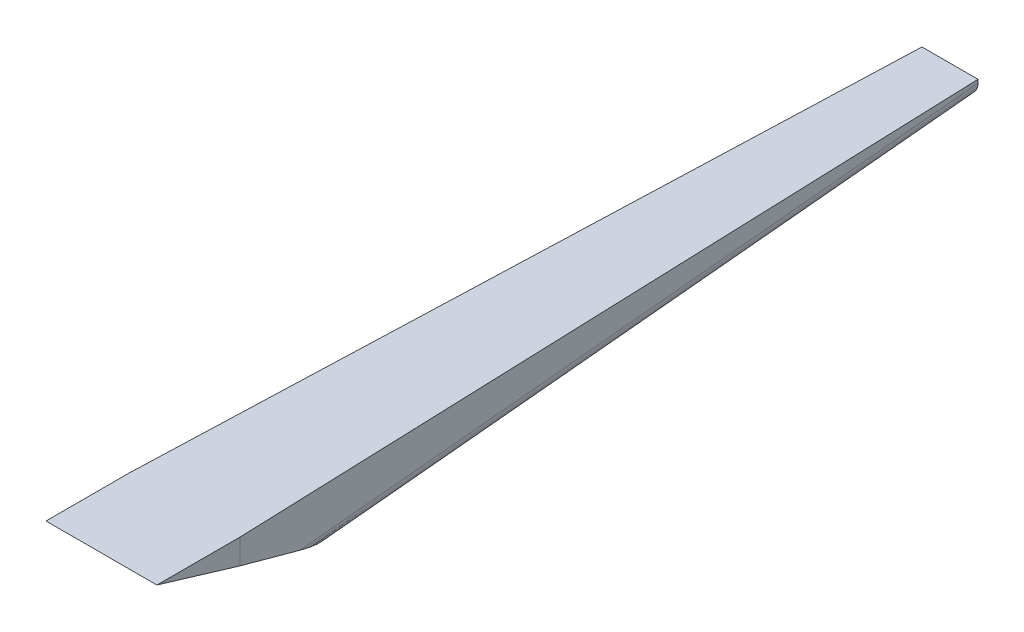
ISO-10303-21;
HEADER;
FILE_DESCRIPTION(('STEP AP214'),'2;1');
FILE_NAME('part.step','',(''),(''),'','','');
FILE_SCHEMA(('AUTOMOTIVE_DESIGN { 1 0 10303 214 1 1 1 1 }'));
ENDSEC;
DATA;
#1=APPLICATION_CONTEXT('core data for automotive mechanical design processes');
#2=APPLICATION_PROTOCOL_DEFINITION('international standard','automotive_design',2000,#1);
#3=PRODUCT_CONTEXT('',#1,'mechanical');
#4=PRODUCT('Part','Part','',(#3));
#5=PRODUCT_RELATED_PRODUCT_CATEGORY('part','',(#4));
#6=PRODUCT_DEFINITION_FORMATION('','',#4);
#7=PRODUCT_DEFINITION_CONTEXT('part definition',#1,'design');
#8=PRODUCT_DEFINITION('design','',#6,#7);
#9=PRODUCT_DEFINITION_SHAPE('','',#8);
#10=(LENGTH_UNIT() NAMED_UNIT(*) SI_UNIT(.MILLI.,.METRE.));
#11=(NAMED_UNIT(*) PLANE_ANGLE_UNIT() SI_UNIT($,.RADIAN.));
#12=(NAMED_UNIT(*) SI_UNIT($,.STERADIAN.) SOLID_ANGLE_UNIT());
#13=UNCERTAINTY_MEASURE_WITH_UNIT(LENGTH_MEASURE(1.E-05),#10,'distance_accuracy_value','');
#14=(GEOMETRIC_REPRESENTATION_CONTEXT(3) GLOBAL_UNCERTAINTY_ASSIGNED_CONTEXT((#13)) GLOBAL_UNIT_ASSIGNED_CONTEXT((#10,
#11,#12)) REPRESENTATION_CONTEXT('',''));
#15=CARTESIAN_POINT('',(0.,0.,0.));
#16=DIRECTION('',(0.,0.,1.));
#17=DIRECTION('',(1.,0.,0.));
#18=AXIS2_PLACEMENT_3D('',#15,#16,#17);
#19=CARTESIAN_POINT('',(0.,5.08000000000002,0.));
#20=DIRECTION('',(0.,1.,0.));
#21=DIRECTION('',(0.,0.,1.));
#22=AXIS2_PLACEMENT_3D('',#19,#20,#21);
#23=PLANE('',#22);
#24=DIRECTION('',(-1.,0.,0.));
#25=VECTOR('',#24,1.);
#26=CARTESIAN_POINT('',(0.,5.08000000000002,-1081.98530026192));
#27=LINE('',#26,#25);
#28=CARTESIAN_POINT('',(25.6657479035088,5.08000000000002,-1081.98530026192));
#29=VERTEX_POINT('',#28);
#30=CARTESIAN_POINT('',(-25.6657479035088,5.08000000000002,-1081.98530026192));
#31=VERTEX_POINT('',#30);
#32=EDGE_CURVE('E134',#29,#31,#27,.T.);
#33=ORIENTED_EDGE('',*,*,#32,.T.);
#34=DIRECTION('',(-0.0358377664788086,0.,0.999357620921465));
#35=VECTOR('',#34,1.);
#36=CARTESIAN_POINT('',(-64.3838118894423,5.08000000000002,-2.30885517576966));
#37=LINE('',#36,#35);
#38=CARTESIAN_POINT('',(-50.8,5.08000000000002,-381.1016));
#39=VERTEX_POINT('',#38);
#40=EDGE_CURVE('E124',#31,#39,#37,.T.);
#41=ORIENTED_EDGE('',*,*,#40,.T.);
#42=DIRECTION('',(0.,0.,-1.));
#43=VECTOR('',#42,1.);
#44=CARTESIAN_POINT('',(-50.8,5.08000000000002,-381.1016));
#45=LINE('',#44,#43);
#46=CARTESIAN_POINT('',(-50.8,5.08000000000002,-304.8));
#47=VERTEX_POINT('',#46);
#48=EDGE_CURVE('E111',#47,#39,#45,.T.);
#49=ORIENTED_EDGE('',*,*,#48,.F.);
#50=DIRECTION('',(1.,0.,0.));
#51=VECTOR('',#50,1.);
#52=CARTESIAN_POINT('',(-50.810023925187,5.08000000000002,-304.8));
#53=LINE('',#52,#51);
#54=CARTESIAN_POINT('',(50.8,5.08000000000002,-304.8));
#55=VERTEX_POINT('',#54);
#56=EDGE_CURVE('E122',#47,#55,#53,.T.);
#57=ORIENTED_EDGE('',*,*,#56,.T.);
#58=DIRECTION('',(0.,0.,1.));
#59=VECTOR('',#58,1.);
#60=CARTESIAN_POINT('',(50.8,5.08000000000002,-381.1016));
#61=LINE('',#60,#59);
#62=CARTESIAN_POINT('',(50.8,5.08000000000002,-381.1016));
#63=VERTEX_POINT('',#62);
#64=EDGE_CURVE('E126',#63,#55,#61,.T.);
#65=ORIENTED_EDGE('',*,*,#64,.F.);
#66=DIRECTION('',(-0.0358377664788086,0.,-0.999357620921465));
#67=VECTOR('',#66,1.);
#68=CARTESIAN_POINT('',(64.3838118894422,5.08000000000002,-2.30885517576965));
#69=LINE('',#68,#67);
#70=EDGE_CURVE('E130',#63,#29,#69,.T.);
#71=ORIENTED_EDGE('',*,*,#70,.T.);
#72=EDGE_LOOP('',(#33,#41,#49,#57,#65,#71));
#73=FACE_BOUND('',#72,.T.);
#74=ADVANCED_FACE('F45',(#73),#23,.T.);
#75=CARTESIAN_POINT('',(0.,0.,-1081.98530026192));
#76=DIRECTION('',(0.,0.,1.));
#77=DIRECTION('',(1.,0.,0.));
#78=AXIS2_PLACEMENT_3D('',#75,#76,#77);
#79=PLANE('',#78);
#80=ORIENTED_EDGE('',*,*,#32,.F.);
#81=DIRECTION('',(0.,1.,0.));
#82=VECTOR('',#81,1.);
#83=CARTESIAN_POINT('',(25.6657479035088,0.,-1081.98530026192));
#84=LINE('',#83,#82);
#85=CARTESIAN_POINT('',(25.6657479035088,2.10957667069887,-1081.98530026192));
#86=VERTEX_POINT('',#85);
#87=EDGE_CURVE('E145',#86,#29,#84,.T.);
#88=ORIENTED_EDGE('',*,*,#87,.F.);
#89=CARTESIAN_POINT('',(12.9575844451766,2.13569134690628,-1081.98530026192));
#90=DIRECTION('',(0.,0.,1.));
#91=DIRECTION('',(0.52999894000318,-0.847998304005088,0.));
#92=AXIS2_PLACEMENT_3D('',#89,#90,#91);
#93=ELLIPSE('',#92,12.7290380548547,12.7);
#94=CARTESIAN_POINT('',(12.9836729992225,-10.5851966456141,-1081.98530026192));
#95=VERTEX_POINT('',#94);
#96=EDGE_CURVE('E135',#86,#95,#93,.F.);
#97=ORIENTED_EDGE('',*,*,#96,.T.);
#98=DIRECTION('',(1.,0.,0.));
#99=VECTOR('',#98,1.);
#100=CARTESIAN_POINT('',(0.,-10.585196645614,-1081.98530026192));
#101=LINE('',#100,#99);
#102=CARTESIAN_POINT('',(-12.9836729992225,-10.5851966456141,-1081.98530026192));
#103=VERTEX_POINT('',#102);
#104=EDGE_CURVE('E144',#103,#95,#101,.T.);
#105=ORIENTED_EDGE('',*,*,#104,.F.);
#106=CARTESIAN_POINT('',(-12.9575844451766,2.13569134690629,-1081.98530026192));
#107=DIRECTION('',(0.,0.,1.));
#108=DIRECTION('',(-0.52999894000318,-0.847998304005088,0.));
#109=AXIS2_PLACEMENT_3D('',#106,#107,#108);
#110=ELLIPSE('',#109,12.7290380548547,12.7);
#111=CARTESIAN_POINT('',(-25.6657479035088,2.10957667069887,-1081.98530026192));
#112=VERTEX_POINT('',#111);
#113=EDGE_CURVE('E125',#103,#112,#110,.F.);
#114=ORIENTED_EDGE('',*,*,#113,.T.);
#115=DIRECTION('',(0.,-1.,0.));
#116=VECTOR('',#115,1.);
#117=CARTESIAN_POINT('',(-25.6657479035088,0.,-1081.98530026192));
#118=LINE('',#117,#116);
#119=EDGE_CURVE('E141',#31,#112,#118,.T.);
#120=ORIENTED_EDGE('',*,*,#119,.F.);
#121=EDGE_LOOP('',(#80,#88,#97,#105,#114,#120));
#122=FACE_BOUND('',#121,.T.);
#123=ADVANCED_FACE('F196',(#122),#79,.F.);
#124=CARTESIAN_POINT('',(50.8,-50.8,-381.1016));
#125=DIRECTION('',(1.,0.,0.));
#126=DIRECTION('',(0.,0.,-1.));
#127=AXIS2_PLACEMENT_3D('',#124,#125,#126);
#128=PLANE('',#127);
#129=DIRECTION('',(0.,1.,0.));
#130=VECTOR('',#129,1.);
#131=CARTESIAN_POINT('',(50.8,-50.8,-381.1016));
#132=LINE('',#131,#130);
#133=CARTESIAN_POINT('',(50.8,-17.8349847126098,-381.1016));
#134=VERTEX_POINT('',#133);
#135=EDGE_CURVE('E54',#134,#63,#132,.T.);
#136=ORIENTED_EDGE('',*,*,#135,.T.);
#137=ORIENTED_EDGE('',*,*,#64,.T.);
#138=DIRECTION('',(0.,0.287630060624882,0.957741587394495));
#139=VECTOR('',#138,1.);
#140=CARTESIAN_POINT('',(50.8,-20.5622150991169,-390.182646514712));
#141=LINE('',#140,#139);
#142=EDGE_CURVE('E68',#134,#55,#141,.T.);
#143=ORIENTED_EDGE('',*,*,#142,.F.);
#144=EDGE_LOOP('',(#136,#137,#143));
#145=FACE_BOUND('',#144,.T.);
#146=ADVANCED_FACE('F204',(#145),#128,.T.);
#147=CARTESIAN_POINT('',(-50.8,-50.8,-381.1016));
#148=DIRECTION('',(-1.,0.,0.));
#149=DIRECTION('',(0.,0.,1.));
#150=AXIS2_PLACEMENT_3D('',#147,#148,#149);
#151=PLANE('',#150);
#152=DIRECTION('',(0.,-0.287630060624882,-0.957741587394495));
#153=VECTOR('',#152,1.);
#154=CARTESIAN_POINT('',(-50.8,-20.5622150991169,-390.182646514712));
#155=LINE('',#154,#153);
#156=CARTESIAN_POINT('',(-50.8,-17.8349847126097,-381.1016));
#157=VERTEX_POINT('',#156);
#158=EDGE_CURVE('E108',#47,#157,#155,.T.);
#159=ORIENTED_EDGE('',*,*,#158,.F.);
#160=ORIENTED_EDGE('',*,*,#48,.T.);
#161=DIRECTION('',(0.,1.,0.));
#162=VECTOR('',#161,1.);
#163=CARTESIAN_POINT('',(-50.8,-50.8,-381.1016));
#164=LINE('',#163,#162);
#165=EDGE_CURVE('E11',#39,#157,#164,.F.);
#166=ORIENTED_EDGE('',*,*,#165,.T.);
#167=EDGE_LOOP('',(#159,#160,#166));
#168=FACE_BOUND('',#167,.T.);
#169=ADVANCED_FACE('F110',(#168),#151,.T.);
#170=CARTESIAN_POINT('',(64.3838118894422,0.,-2.30885517576965));
#171=DIRECTION('',(-0.999357620921465,0.,0.0358377664788086));
#172=DIRECTION('',(0.0358377664788086,0.,0.999357620921465));
#173=AXIS2_PLACEMENT_3D('',#170,#171,#172);
#174=PLANE('',#173);
#175=ORIENTED_EDGE('',*,*,#70,.F.);
#176=ORIENTED_EDGE('',*,*,#135,.F.);
#177=DIRECTION('',(-0.0343251430179368,-0.287460565595073,-0.957177208140979));
#178=VECTOR('',#177,1.);
#179=CARTESIAN_POINT('',(63.4373129508137,87.9979065456885,-28.70254597879));
#180=LINE('',#179,#178);
#181=CARTESIAN_POINT('',(48.767821308913,-34.8537407779479,-437.770122108174));
#182=VERTEX_POINT('',#181);
#183=EDGE_CURVE('E116',#134,#182,#180,.T.);
#184=ORIENTED_EDGE('',*,*,#183,.T.);
#185=DIRECTION('',(0.0357789954301019,-0.057246392688163,0.997718754965649));
#186=VECTOR('',#185,1.);
#187=CARTESIAN_POINT('',(64.2612478801468,-59.643223291922,-5.7266261133783));
#188=LINE('',#187,#186);
#189=EDGE_CURVE('E164',#182,#86,#188,.F.);
#190=ORIENTED_EDGE('',*,*,#189,.T.);
#191=ORIENTED_EDGE('',*,*,#87,.T.);
#192=EDGE_LOOP('',(#175,#176,#184,#190,#191));
#193=FACE_BOUND('',#192,.T.);
#194=ADVANCED_FACE('F47',(#193),#174,.F.);
#195=CARTESIAN_POINT('',(-64.3838118894423,0.,-2.30885517576966));
#196=DIRECTION('',(0.999357620921465,0.,0.0358377664788086));
#197=DIRECTION('',(0.0358377664788086,0.,-0.999357620921465));
#198=AXIS2_PLACEMENT_3D('',#195,#196,#197);
#199=PLANE('',#198);
#200=ORIENTED_EDGE('',*,*,#40,.F.);
#201=ORIENTED_EDGE('',*,*,#119,.T.);
#202=DIRECTION('',(-0.0357789954301019,-0.057246392688163,0.997718754965649));
#203=VECTOR('',#202,1.);
#204=CARTESIAN_POINT('',(-64.2612478801468,-59.643223291922,-5.72662611337831));
#205=LINE('',#204,#203);
#206=CARTESIAN_POINT('',(-48.7678213089131,-34.8537407779479,-437.770122108174));
#207=VERTEX_POINT('',#206);
#208=EDGE_CURVE('E167',#112,#207,#205,.T.);
#209=ORIENTED_EDGE('',*,*,#208,.T.);
#210=DIRECTION('',(-0.0343251430179368,0.287460565595073,0.957177208140979));
#211=VECTOR('',#210,1.);
#212=CARTESIAN_POINT('',(-63.4373129508137,87.9979065456885,-28.70254597879));
#213=LINE('',#212,#211);
#214=EDGE_CURVE('E178',#207,#157,#213,.T.);
#215=ORIENTED_EDGE('',*,*,#214,.T.);
#216=ORIENTED_EDGE('',*,*,#165,.F.);
#217=EDGE_LOOP('',(#200,#201,#209,#215,#216));
#218=FACE_BOUND('',#217,.T.);
#219=ADVANCED_FACE('F205',(#218),#199,.F.);
#220=CARTESIAN_POINT('',(-50.810023925187,5.08000000000002,-304.8));
#221=DIRECTION('',(0.,0.957741587394495,-0.287630060624882));
#222=DIRECTION('',(0.,0.287630060624882,0.957741587394495));
#223=AXIS2_PLACEMENT_3D('',#220,#221,#222);
#224=PLANE('',#223);
#225=ORIENTED_EDGE('',*,*,#158,.T.);
#226=ORIENTED_EDGE('',*,*,#214,.F.);
#227=CARTESIAN_POINT('',(-36.0622759588693,-34.831815075002,-437.697114587686));
#228=DIRECTION('',(0.,0.957741587394495,-0.287630060624882));
#229=DIRECTION('',(-0.0380719835720617,0.287421528606686,0.957047223996959));
#230=AXIS2_PLACEMENT_3D('',#227,#228,#229);
#231=ELLIPSE('',#230,37.1561059421082,12.7);
#232=CARTESIAN_POINT('',(-34.8130409352791,-45.5121853433046,-473.260277744215));
#233=VERTEX_POINT('',#232);
#234=EDGE_CURVE('E163',#207,#233,#231,.F.);
#235=ORIENTED_EDGE('',*,*,#234,.T.);
#236=DIRECTION('',(-1.,0.,0.));
#237=VECTOR('',#236,1.);
#238=CARTESIAN_POINT('',(1.8594081385154E-13,-45.5121853433046,-473.260277744215));
#239=LINE('',#238,#237);
#240=CARTESIAN_POINT('',(34.8130409352791,-45.5121853433046,-473.260277744215));
#241=VERTEX_POINT('',#240);
#242=EDGE_CURVE('E159',#241,#233,#239,.T.);
#243=ORIENTED_EDGE('',*,*,#242,.F.);
#244=CARTESIAN_POINT('',(36.0622759588692,-34.831815075002,-437.697114587686));
#245=DIRECTION('',(0.,0.957741587394495,-0.287630060624882));
#246=DIRECTION('',(0.0380719835720616,0.287421528606686,0.957047223996959));
#247=AXIS2_PLACEMENT_3D('',#244,#245,#246);
#248=ELLIPSE('',#247,37.1561059421082,12.7);
#249=EDGE_CURVE('E143',#241,#182,#248,.F.);
#250=ORIENTED_EDGE('',*,*,#249,.T.);
#251=ORIENTED_EDGE('',*,*,#183,.F.);
#252=ORIENTED_EDGE('',*,*,#142,.T.);
#253=ORIENTED_EDGE('',*,*,#56,.F.);
#254=EDGE_LOOP('',(#225,#226,#235,#243,#250,#251,#252,#253));
#255=FACE_BOUND('',#254,.T.);
#256=ADVANCED_FACE('F128',(#255),#224,.F.);
#257=CARTESIAN_POINT('',(0.,-72.4281303938191,-4.15572943132336));
#258=DIRECTION('',(0.,0.998357976854082,0.0572830695042076));
#259=DIRECTION('',(0.,-0.0572830695042076,0.998357976854082));
#260=AXIS2_PLACEMENT_3D('',#257,#258,#259);
#261=PLANE('',#260);
#262=DIRECTION('',(-0.0357789954301019,-0.0572463926881631,0.997718754965649));
#263=VECTOR('',#262,1.);
#264=CARTESIAN_POINT('',(-51.5694060944442,-72.3223695979688,-5.99898146180087));
#265=LINE('',#264,#263);
#266=EDGE_CURVE('E140',#233,#103,#265,.F.);
#267=ORIENTED_EDGE('',*,*,#266,.T.);
#268=ORIENTED_EDGE('',*,*,#104,.T.);
#269=DIRECTION('',(0.0357789954301019,-0.057246392688163,0.997718754965649));
#270=VECTOR('',#269,1.);
#271=CARTESIAN_POINT('',(51.5694060944442,-72.3223695979688,-5.99898146180087));
#272=LINE('',#271,#270);
#273=EDGE_CURVE('E158',#95,#241,#272,.T.);
#274=ORIENTED_EDGE('',*,*,#273,.T.);
#275=ORIENTED_EDGE('',*,*,#242,.T.);
#276=EDGE_LOOP('',(#267,#268,#274,#275));
#277=FACE_BOUND('',#276,.T.);
#278=ADVANCED_FACE('F183',(#277),#261,.F.);
#279=CARTESIAN_POINT('',(51.5694060944442,-59.643223291922,-5.27148647909743));
#280=DIRECTION('',(0.0357789954301019,-0.057246392688163,0.997718754965649));
#281=DIRECTION('',(0.,-0.998357976854082,-0.0572830695042076));
#282=AXIS2_PLACEMENT_3D('',#279,#280,#281);
#283=CYLINDRICAL_SURFACE('',#282,12.7);
#284=ORIENTED_EDGE('',*,*,#96,.F.);
#285=ORIENTED_EDGE('',*,*,#189,.F.);
#286=ORIENTED_EDGE('',*,*,#249,.F.);
#287=ORIENTED_EDGE('',*,*,#273,.F.);
#288=EDGE_LOOP('',(#284,#285,#286,#287));
#289=FACE_BOUND('',#288,.T.);
#290=ADVANCED_FACE('F200',(#289),#283,.T.);
#291=CARTESIAN_POINT('',(-51.5694060944442,-59.643223291922,-5.27148647909744));
#292=DIRECTION('',(-0.0357789954301019,-0.0572463926881631,0.997718754965649));
#293=DIRECTION('',(0.,-0.998357976854082,-0.0572830695042076));
#294=AXIS2_PLACEMENT_3D('',#291,#292,#293);
#295=CYLINDRICAL_SURFACE('',#294,12.7);
#296=ORIENTED_EDGE('',*,*,#113,.F.);
#297=ORIENTED_EDGE('',*,*,#266,.F.);
#298=ORIENTED_EDGE('',*,*,#234,.F.);
#299=ORIENTED_EDGE('',*,*,#208,.F.);
#300=EDGE_LOOP('',(#296,#297,#298,#299));
#301=FACE_BOUND('',#300,.T.);
#302=ADVANCED_FACE('F190',(#301),#295,.T.);
#303=CLOSED_SHELL('',(#74,#123,#146,#169,#194,#219,#256,#278,#290,#302));
#304=MANIFOLD_SOLID_BREP('B2',#303);
#305=ADVANCED_BREP_SHAPE_REPRESENTATION('',(#18,#304),#14);
#306=SHAPE_DEFINITION_REPRESENTATION(#9,#305);
ENDSEC;
END-ISO-10303-21;
